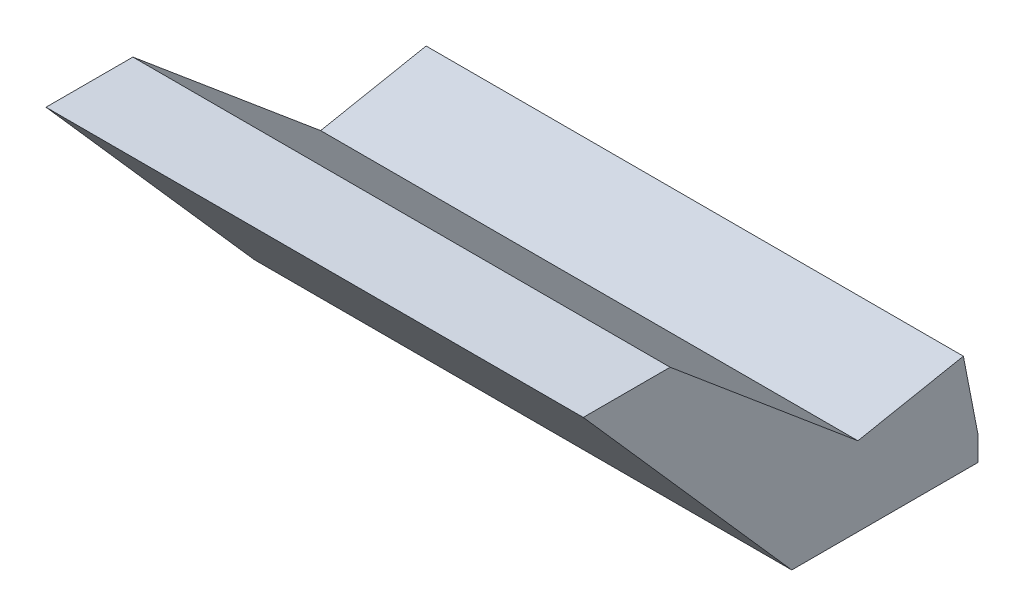
ISO-10303-21;
HEADER;
FILE_DESCRIPTION(('STEP AP214'),'2;1');
FILE_NAME('part.step','',(''),(''),'','','');
FILE_SCHEMA(('AUTOMOTIVE_DESIGN { 1 0 10303 214 1 1 1 1 }'));
ENDSEC;
DATA;
#1=APPLICATION_CONTEXT('core data for automotive mechanical design processes');
#2=APPLICATION_PROTOCOL_DEFINITION('international standard','automotive_design',2000,#1);
#3=PRODUCT_CONTEXT('',#1,'mechanical');
#4=PRODUCT('Part','Part','',(#3));
#5=PRODUCT_RELATED_PRODUCT_CATEGORY('part','',(#4));
#6=PRODUCT_DEFINITION_FORMATION('','',#4);
#7=PRODUCT_DEFINITION_CONTEXT('part definition',#1,'design');
#8=PRODUCT_DEFINITION('design','',#6,#7);
#9=PRODUCT_DEFINITION_SHAPE('','',#8);
#10=(LENGTH_UNIT() NAMED_UNIT(*) SI_UNIT(.MILLI.,.METRE.));
#11=(NAMED_UNIT(*) PLANE_ANGLE_UNIT() SI_UNIT($,.RADIAN.));
#12=(NAMED_UNIT(*) SI_UNIT($,.STERADIAN.) SOLID_ANGLE_UNIT());
#13=UNCERTAINTY_MEASURE_WITH_UNIT(LENGTH_MEASURE(1.E-05),#10,'distance_accuracy_value','');
#14=(GEOMETRIC_REPRESENTATION_CONTEXT(3) GLOBAL_UNCERTAINTY_ASSIGNED_CONTEXT((#13)) GLOBAL_UNIT_ASSIGNED_CONTEXT((#10,
#11,#12)) REPRESENTATION_CONTEXT('',''));
#15=CARTESIAN_POINT('',(0.,0.,0.));
#16=DIRECTION('',(0.,0.,1.));
#17=DIRECTION('',(1.,0.,0.));
#18=AXIS2_PLACEMENT_3D('',#15,#16,#17);
#19=CARTESIAN_POINT('',(0.5,1.06,-0.154751253653));
#20=DIRECTION('',(0.,-0.661458386943164,0.749981868009186));
#21=DIRECTION('',(-1.,0.,0.));
#22=AXIS2_PLACEMENT_3D('',#19,#20,#21);
#23=PLANE('',#22);
#24=DIRECTION('',(-1.,0.,0.));
#25=VECTOR('',#24,1.);
#26=CARTESIAN_POINT('',(0.975,1.5,0.233313715208));
#27=LINE('',#26,#25);
#28=CARTESIAN_POINT('',(0.5,1.5,0.233313715208));
#29=VERTEX_POINT('',#28);
#30=CARTESIAN_POINT('',(-0.5,1.5,0.233313715208));
#31=VERTEX_POINT('',#30);
#32=EDGE_CURVE('E27',#29,#31,#27,.T.);
#33=ORIENTED_EDGE('',*,*,#32,.T.);
#34=DIRECTION('',(0.,-0.749981868009186,-0.661458386943164));
#35=VECTOR('',#34,1.);
#36=CARTESIAN_POINT('',(-0.5,1.349520850659,0.10059624611));
#37=LINE('',#36,#35);
#38=CARTESIAN_POINT('',(-0.5,1.06,-0.154751253653));
#39=VERTEX_POINT('',#38);
#40=EDGE_CURVE('E136',#31,#39,#37,.T.);
#41=ORIENTED_EDGE('',*,*,#40,.T.);
#42=DIRECTION('',(-1.,0.,0.));
#43=VECTOR('',#42,1.);
#44=CARTESIAN_POINT('',(0.5,1.06,-0.154751253653));
#45=LINE('',#44,#43);
#46=CARTESIAN_POINT('',(0.5,1.06,-0.154751253653));
#47=VERTEX_POINT('',#46);
#48=EDGE_CURVE('E11',#47,#39,#45,.T.);
#49=ORIENTED_EDGE('',*,*,#48,.F.);
#50=DIRECTION('',(0.,0.749981868009186,0.661458386943164));
#51=VECTOR('',#50,1.);
#52=CARTESIAN_POINT('',(0.5,0.974012491388,-0.23058929877));
#53=LINE('',#52,#51);
#54=EDGE_CURVE('E142',#47,#29,#53,.T.);
#55=ORIENTED_EDGE('',*,*,#54,.T.);
#56=EDGE_LOOP('',(#33,#41,#49,#55));
#57=FACE_BOUND('',#56,.T.);
#58=ADVANCED_FACE('F16',(#57),#23,.T.);
#59=CARTESIAN_POINT('',(0.5,1.06,-0.501417909));
#60=DIRECTION('',(0.,-1.,0.));
#61=DIRECTION('',(0.,0.,-1.));
#62=AXIS2_PLACEMENT_3D('',#59,#60,#61);
#63=PLANE('',#62);
#64=DIRECTION('',(0.,0.,1.));
#65=VECTOR('',#64,1.);
#66=CARTESIAN_POINT('',(-0.5,1.06,-0.501417909));
#67=LINE('',#66,#65);
#68=CARTESIAN_POINT('',(-0.5,1.06,-0.501417909));
#69=VERTEX_POINT('',#68);
#70=EDGE_CURVE('E126',#69,#39,#67,.T.);
#71=ORIENTED_EDGE('',*,*,#70,.F.);
#72=DIRECTION('',(1.,0.,0.));
#73=VECTOR('',#72,1.);
#74=CARTESIAN_POINT('',(-0.75,1.06,-0.501417908943));
#75=LINE('',#74,#73);
#76=CARTESIAN_POINT('',(0.5,1.06,-0.501417909));
#77=VERTEX_POINT('',#76);
#78=EDGE_CURVE('E138',#69,#77,#75,.T.);
#79=ORIENTED_EDGE('',*,*,#78,.T.);
#80=DIRECTION('',(0.,0.,-1.));
#81=VECTOR('',#80,1.);
#82=CARTESIAN_POINT('',(0.5,1.06,0.57));
#83=LINE('',#82,#81);
#84=EDGE_CURVE('E90',#47,#77,#83,.T.);
#85=ORIENTED_EDGE('',*,*,#84,.F.);
#86=ORIENTED_EDGE('',*,*,#48,.T.);
#87=EDGE_LOOP('',(#71,#79,#85,#86));
#88=FACE_BOUND('',#87,.T.);
#89=ADVANCED_FACE('F185',(#88),#63,.T.);
#90=CARTESIAN_POINT('',(1.45,1.5,-1.6));
#91=DIRECTION('',(0.,1.,0.));
#92=DIRECTION('',(1.,0.,0.));
#93=AXIS2_PLACEMENT_3D('',#90,#91,#92);
#94=PLANE('',#93);
#95=ORIENTED_EDGE('',*,*,#32,.F.);
#96=DIRECTION('',(0.,0.,1.));
#97=VECTOR('',#96,1.);
#98=CARTESIAN_POINT('',(0.5,1.5,-0.370430952152));
#99=LINE('',#98,#97);
#100=CARTESIAN_POINT('',(0.5,1.5,0.07160190204808));
#101=VERTEX_POINT('',#100);
#102=EDGE_CURVE('E81',#101,#29,#99,.T.);
#103=ORIENTED_EDGE('',*,*,#102,.F.);
#104=DIRECTION('',(1.,0.,0.));
#105=VECTOR('',#104,1.);
#106=CARTESIAN_POINT('',(-0.274436479009,1.5,0.07160190204808));
#107=LINE('',#106,#105);
#108=CARTESIAN_POINT('',(-0.5,1.5,0.07160190204808));
#109=VERTEX_POINT('',#108);
#110=EDGE_CURVE('E85',#109,#101,#107,.T.);
#111=ORIENTED_EDGE('',*,*,#110,.F.);
#112=DIRECTION('',(0.,0.,-1.));
#113=VECTOR('',#112,1.);
#114=CARTESIAN_POINT('',(-0.5,1.5,0.02932900146708));
#115=LINE('',#114,#113);
#116=EDGE_CURVE('E157',#31,#109,#115,.T.);
#117=ORIENTED_EDGE('',*,*,#116,.F.);
#118=EDGE_LOOP('',(#95,#103,#111,#117));
#119=FACE_BOUND('',#118,.T.);
#120=ADVANCED_FACE('F83',(#119),#94,.T.);
#121=CARTESIAN_POINT('',(0.5,1.06,-0.501417909));
#122=DIRECTION('',(1.,0.,0.));
#123=DIRECTION('',(0.,1.,0.));
#124=AXIS2_PLACEMENT_3D('',#121,#122,#123);
#125=PLANE('',#124);
#126=ORIENTED_EDGE('',*,*,#54,.F.);
#127=ORIENTED_EDGE('',*,*,#84,.T.);
#128=DIRECTION('',(0.,1.,0.));
#129=VECTOR('',#128,1.);
#130=CARTESIAN_POINT('',(0.5,1.06,-0.501417909));
#131=LINE('',#130,#129);
#132=CARTESIAN_POINT('',(0.5,1.104938393442,-0.501417909));
#133=VERTEX_POINT('',#132);
#134=EDGE_CURVE('E20',#77,#133,#131,.T.);
#135=ORIENTED_EDGE('',*,*,#134,.T.);
#136=DIRECTION('',(0.,0.981627183740114,0.190808993872022));
#137=VECTOR('',#136,1.);
#138=CARTESIAN_POINT('',(0.5,1.104938393442,-0.501417909));
#139=LINE('',#138,#137);
#140=CARTESIAN_POINT('',(0.5,1.24490722682,-0.474210724121));
#141=VERTEX_POINT('',#140);
#142=EDGE_CURVE('E124',#133,#141,#139,.T.);
#143=ORIENTED_EDGE('',*,*,#142,.T.);
#144=DIRECTION('',(0.,-0.190808994824976,0.981627183554878));
#145=VECTOR('',#144,1.);
#146=CARTESIAN_POINT('',(0.5,1.104938393442,0.245866501904));
#147=LINE('',#146,#145);
#148=CARTESIAN_POINT('',(0.5,1.206745427975,-0.27788528803));
#149=VERTEX_POINT('',#148);
#150=EDGE_CURVE('E95',#141,#149,#147,.T.);
#151=ORIENTED_EDGE('',*,*,#150,.T.);
#152=DIRECTION('',(0.,0.642787609338802,0.766044443410764));
#153=VECTOR('',#152,1.);
#154=CARTESIAN_POINT('',(0.5,1.036045423054,-0.481317632338));
#155=LINE('',#154,#153);
#156=EDGE_CURVE('E93',#149,#101,#155,.T.);
#157=ORIENTED_EDGE('',*,*,#156,.T.);
#158=ORIENTED_EDGE('',*,*,#102,.T.);
#159=EDGE_LOOP('',(#126,#127,#135,#143,#151,#157,#158));
#160=FACE_BOUND('',#159,.T.);
#161=ADVANCED_FACE('F18',(#160),#125,.T.);
#162=CARTESIAN_POINT('',(-0.5,1.06,-0.501417909));
#163=DIRECTION('',(0.,0.,1.));
#164=DIRECTION('',(1.,0.,0.));
#165=AXIS2_PLACEMENT_3D('',#162,#163,#164);
#166=PLANE('',#165);
#167=ORIENTED_EDGE('',*,*,#134,.F.);
#168=ORIENTED_EDGE('',*,*,#78,.F.);
#169=DIRECTION('',(0.,-1.,0.));
#170=VECTOR('',#169,1.);
#171=CARTESIAN_POINT('',(-0.5,1.104938393202,-0.501417909));
#172=LINE('',#171,#170);
#173=CARTESIAN_POINT('',(-0.5,1.104938393202,-0.501417909));
#174=VERTEX_POINT('',#173);
#175=EDGE_CURVE('E132',#174,#69,#172,.T.);
#176=ORIENTED_EDGE('',*,*,#175,.F.);
#177=DIRECTION('',(-1.,0.,0.));
#178=VECTOR('',#177,1.);
#179=CARTESIAN_POINT('',(-0.5,1.104938393442,-0.501417909));
#180=LINE('',#179,#178);
#181=EDGE_CURVE('E116',#133,#174,#180,.T.);
#182=ORIENTED_EDGE('',*,*,#181,.F.);
#183=EDGE_LOOP('',(#167,#168,#176,#182));
#184=FACE_BOUND('',#183,.T.);
#185=ADVANCED_FACE('F179',(#184),#166,.F.);
#186=CARTESIAN_POINT('',(-0.5,1.104938393442,-0.501417909));
#187=DIRECTION('',(0.,0.190808993872022,-0.981627183740113));
#188=DIRECTION('',(-1.,0.,0.));
#189=AXIS2_PLACEMENT_3D('',#186,#187,#188);
#190=PLANE('',#189);
#191=ORIENTED_EDGE('',*,*,#181,.T.);
#192=DIRECTION('',(0.,-0.981627183740114,-0.190808993872022));
#193=VECTOR('',#192,1.);
#194=CARTESIAN_POINT('',(-0.5,1.104938393442,-0.501417909));
#195=LINE('',#194,#193);
#196=CARTESIAN_POINT('',(-0.5,1.244907226532,-0.474210724177));
#197=VERTEX_POINT('',#196);
#198=EDGE_CURVE('E112',#197,#174,#195,.T.);
#199=ORIENTED_EDGE('',*,*,#198,.F.);
#200=DIRECTION('',(1.,0.,0.));
#201=VECTOR('',#200,1.);
#202=CARTESIAN_POINT('',(-0.5,1.244907227016,-0.474210724083));
#203=LINE('',#202,#201);
#204=EDGE_CURVE('E113',#197,#141,#203,.T.);
#205=ORIENTED_EDGE('',*,*,#204,.T.);
#206=ORIENTED_EDGE('',*,*,#142,.F.);
#207=EDGE_LOOP('',(#191,#199,#205,#206));
#208=FACE_BOUND('',#207,.T.);
#209=ADVANCED_FACE('F174',(#208),#190,.T.);
#210=CARTESIAN_POINT('',(-0.5,1.206745428,-0.277885288));
#211=DIRECTION('',(0.,-0.981627183392769,-0.190808995658955));
#212=DIRECTION('',(0.,0.190808995658955,-0.981627183392769));
#213=AXIS2_PLACEMENT_3D('',#210,#211,#212);
#214=PLANE('',#213);
#215=ORIENTED_EDGE('',*,*,#150,.F.);
#216=ORIENTED_EDGE('',*,*,#204,.F.);
#217=DIRECTION('',(0.,0.190808994259943,-0.981627183664709));
#218=VECTOR('',#217,1.);
#219=CARTESIAN_POINT('',(-0.5,1.094784841709,0.298101998239));
#220=LINE('',#219,#218);
#221=CARTESIAN_POINT('',(-0.5,1.206745427828,-0.277885288205));
#222=VERTEX_POINT('',#221);
#223=EDGE_CURVE('E159',#222,#197,#220,.T.);
#224=ORIENTED_EDGE('',*,*,#223,.F.);
#225=DIRECTION('',(-1.,0.,0.));
#226=VECTOR('',#225,1.);
#227=CARTESIAN_POINT('',(-0.5,1.206745428,-0.277885288));
#228=LINE('',#227,#226);
#229=EDGE_CURVE('E100',#149,#222,#228,.T.);
#230=ORIENTED_EDGE('',*,*,#229,.F.);
#231=EDGE_LOOP('',(#215,#216,#224,#230));
#232=FACE_BOUND('',#231,.T.);
#233=ADVANCED_FACE('F197',(#232),#214,.F.);
#234=CARTESIAN_POINT('',(-0.5,1.690056146761,0.298101998239));
#235=DIRECTION('',(-1.,0.,0.));
#236=DIRECTION('',(0.,0.,1.));
#237=AXIS2_PLACEMENT_3D('',#234,#235,#236);
#238=PLANE('',#237);
#239=ORIENTED_EDGE('',*,*,#40,.F.);
#240=ORIENTED_EDGE('',*,*,#116,.T.);
#241=DIRECTION('',(0.,-0.642787609338802,-0.766044443410764));
#242=VECTOR('',#241,1.);
#243=CARTESIAN_POINT('',(-0.5,1.690056146901,0.298101998121));
#244=LINE('',#243,#242);
#245=EDGE_CURVE('E105',#109,#222,#244,.T.);
#246=ORIENTED_EDGE('',*,*,#245,.T.);
#247=ORIENTED_EDGE('',*,*,#223,.T.);
#248=ORIENTED_EDGE('',*,*,#198,.T.);
#249=ORIENTED_EDGE('',*,*,#175,.T.);
#250=ORIENTED_EDGE('',*,*,#70,.T.);
#251=EDGE_LOOP('',(#239,#240,#246,#247,#248,#249,#250));
#252=FACE_BOUND('',#251,.T.);
#253=ADVANCED_FACE('F172',(#252),#238,.T.);
#254=CARTESIAN_POINT('',(-0.5,1.690056147,0.298101998239));
#255=DIRECTION('',(0.,0.766044443410764,-0.642787609338802));
#256=DIRECTION('',(-1.,0.,0.));
#257=AXIS2_PLACEMENT_3D('',#254,#255,#256);
#258=PLANE('',#257);
#259=ORIENTED_EDGE('',*,*,#110,.T.);
#260=ORIENTED_EDGE('',*,*,#156,.F.);
#261=ORIENTED_EDGE('',*,*,#229,.T.);
#262=ORIENTED_EDGE('',*,*,#245,.F.);
#263=EDGE_LOOP('',(#259,#260,#261,#262));
#264=FACE_BOUND('',#263,.T.);
#265=ADVANCED_FACE('F103',(#264),#258,.T.);
#266=CLOSED_SHELL('',(#58,#89,#120,#161,#185,#209,#233,#253,#265));
#267=MANIFOLD_SOLID_BREP('B1',#266);
#268=ADVANCED_BREP_SHAPE_REPRESENTATION('',(#18,#267),#14);
#269=SHAPE_DEFINITION_REPRESENTATION(#9,#268);
ENDSEC;
END-ISO-10303-21;
